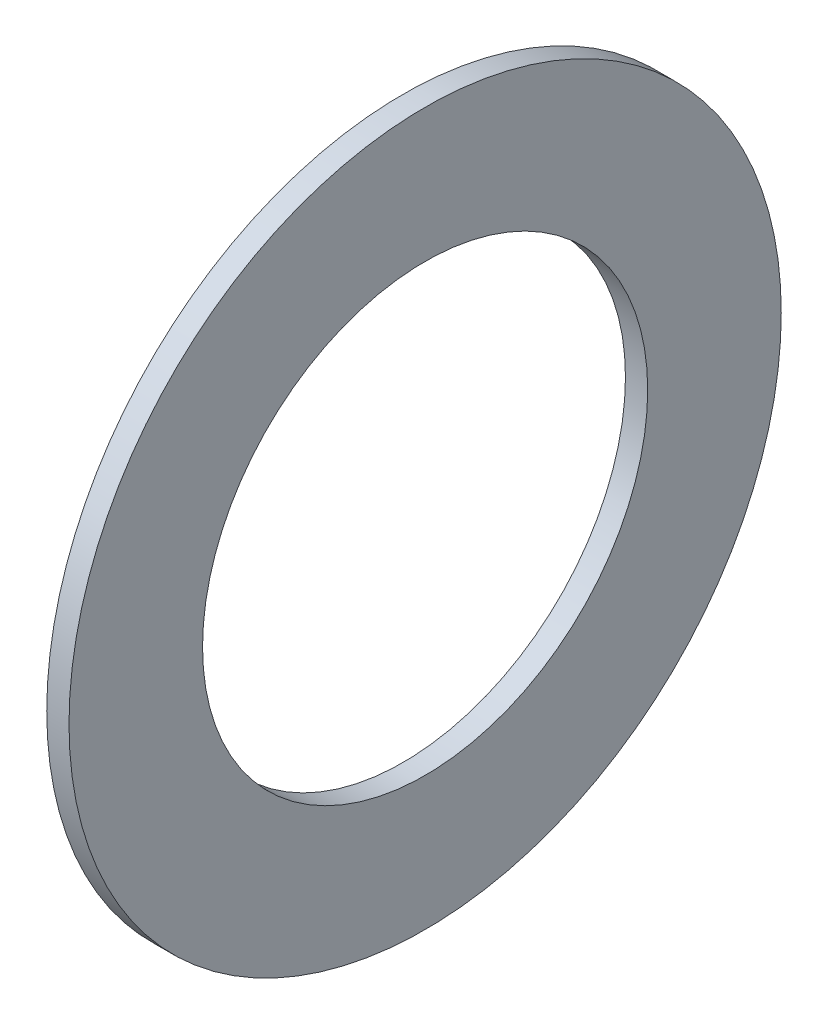
ISO-10303-21;
HEADER;
FILE_DESCRIPTION(('STEP AP214'),'2;1');
FILE_NAME('part.step','',(''),(''),'','','');
FILE_SCHEMA(('AUTOMOTIVE_DESIGN { 1 0 10303 214 1 1 1 1 }'));
ENDSEC;
DATA;
#1=APPLICATION_CONTEXT('core data for automotive mechanical design processes');
#2=APPLICATION_PROTOCOL_DEFINITION('international standard','automotive_design',2000,#1);
#3=PRODUCT_CONTEXT('',#1,'mechanical');
#4=PRODUCT('Part','Part','',(#3));
#5=PRODUCT_RELATED_PRODUCT_CATEGORY('part','',(#4));
#6=PRODUCT_DEFINITION_FORMATION('','',#4);
#7=PRODUCT_DEFINITION_CONTEXT('part definition',#1,'design');
#8=PRODUCT_DEFINITION('design','',#6,#7);
#9=PRODUCT_DEFINITION_SHAPE('','',#8);
#10=(LENGTH_UNIT() NAMED_UNIT(*) SI_UNIT(.MILLI.,.METRE.));
#11=(NAMED_UNIT(*) PLANE_ANGLE_UNIT() SI_UNIT($,.RADIAN.));
#12=(NAMED_UNIT(*) SI_UNIT($,.STERADIAN.) SOLID_ANGLE_UNIT());
#13=UNCERTAINTY_MEASURE_WITH_UNIT(LENGTH_MEASURE(1.E-05),#10,'distance_accuracy_value','');
#14=(GEOMETRIC_REPRESENTATION_CONTEXT(3) GLOBAL_UNCERTAINTY_ASSIGNED_CONTEXT((#13)) GLOBAL_UNIT_ASSIGNED_CONTEXT((#10,
#11,#12)) REPRESENTATION_CONTEXT('',''));
#15=CARTESIAN_POINT('',(0.,0.,0.));
#16=DIRECTION('',(0.,0.,1.));
#17=DIRECTION('',(1.,0.,0.));
#18=AXIS2_PLACEMENT_3D('',#15,#16,#17);
#19=CARTESIAN_POINT('',(0.5,0.,0.));
#20=DIRECTION('',(1.,0.,0.));
#21=DIRECTION('',(0.,0.,-1.));
#22=AXIS2_PLACEMENT_3D('',#19,#20,#21);
#23=PLANE('',#22);
#24=CARTESIAN_POINT('',(0.5,0.,0.));
#25=DIRECTION('',(1.,0.,0.));
#26=DIRECTION('',(0.,0.,-1.));
#27=AXIS2_PLACEMENT_3D('',#24,#25,#26);
#28=CIRCLE('',#27,8.);
#29=CARTESIAN_POINT('',(0.5,0.,-8.));
#30=VERTEX_POINT('',#29);
#31=EDGE_CURVE('E10',#30,#30,#28,.T.);
#32=ORIENTED_EDGE('',*,*,#31,.T.);
#33=EDGE_LOOP('',(#32));
#34=FACE_BOUND('',#33,.T.);
#35=CARTESIAN_POINT('',(0.5,0.,0.));
#36=DIRECTION('',(1.,0.,0.));
#37=DIRECTION('',(0.,0.,-1.));
#38=AXIS2_PLACEMENT_3D('',#35,#36,#37);
#39=CIRCLE('',#38,5.);
#40=CARTESIAN_POINT('',(0.5,0.,-5.));
#41=VERTEX_POINT('',#40);
#42=EDGE_CURVE('E41',#41,#41,#39,.T.);
#43=ORIENTED_EDGE('',*,*,#42,.F.);
#44=EDGE_LOOP('',(#43));
#45=FACE_BOUND('',#44,.T.);
#46=ADVANCED_FACE('F30',(#34,#45),#23,.T.);
#47=CARTESIAN_POINT('',(0.,0.,0.));
#48=DIRECTION('',(1.,0.,0.));
#49=DIRECTION('',(0.,0.,-1.));
#50=AXIS2_PLACEMENT_3D('',#47,#48,#49);
#51=PLANE('',#50);
#52=CARTESIAN_POINT('',(0.,0.,0.));
#53=DIRECTION('',(1.,0.,0.));
#54=DIRECTION('',(0.,0.,-1.));
#55=AXIS2_PLACEMENT_3D('',#52,#53,#54);
#56=CIRCLE('',#55,8.);
#57=CARTESIAN_POINT('',(0.,0.,-8.));
#58=VERTEX_POINT('',#57);
#59=EDGE_CURVE('E34',#58,#58,#56,.T.);
#60=ORIENTED_EDGE('',*,*,#59,.F.);
#61=EDGE_LOOP('',(#60));
#62=FACE_BOUND('',#61,.T.);
#63=CARTESIAN_POINT('',(0.,0.,0.));
#64=DIRECTION('',(1.,0.,0.));
#65=DIRECTION('',(0.,0.,-1.));
#66=AXIS2_PLACEMENT_3D('',#63,#64,#65);
#67=CIRCLE('',#66,5.);
#68=CARTESIAN_POINT('',(0.,0.,-5.));
#69=VERTEX_POINT('',#68);
#70=EDGE_CURVE('E43',#69,#69,#67,.T.);
#71=ORIENTED_EDGE('',*,*,#70,.T.);
#72=EDGE_LOOP('',(#71));
#73=FACE_BOUND('',#72,.T.);
#74=ADVANCED_FACE('F53',(#62,#73),#51,.F.);
#75=CARTESIAN_POINT('',(0.5,0.,0.));
#76=DIRECTION('',(-1.,0.,0.));
#77=DIRECTION('',(0.,0.,1.));
#78=AXIS2_PLACEMENT_3D('',#75,#76,#77);
#79=CYLINDRICAL_SURFACE('',#78,8.);
#80=ORIENTED_EDGE('',*,*,#31,.F.);
#81=EDGE_LOOP('',(#80));
#82=FACE_BOUND('',#81,.T.);
#83=ORIENTED_EDGE('',*,*,#59,.T.);
#84=EDGE_LOOP('',(#83));
#85=FACE_BOUND('',#84,.T.);
#86=ADVANCED_FACE('F32',(#82,#85),#79,.T.);
#87=CARTESIAN_POINT('',(0.5,0.,0.));
#88=DIRECTION('',(-1.,0.,0.));
#89=DIRECTION('',(0.,0.,1.));
#90=AXIS2_PLACEMENT_3D('',#87,#88,#89);
#91=CYLINDRICAL_SURFACE('',#90,5.);
#92=ORIENTED_EDGE('',*,*,#42,.T.);
#93=EDGE_LOOP('',(#92));
#94=FACE_BOUND('',#93,.T.);
#95=ORIENTED_EDGE('',*,*,#70,.F.);
#96=EDGE_LOOP('',(#95));
#97=FACE_BOUND('',#96,.T.);
#98=ADVANCED_FACE('F49',(#94,#97),#91,.F.);
#99=CLOSED_SHELL('',(#46,#74,#86,#98));
#100=MANIFOLD_SOLID_BREP('B2',#99);
#101=ADVANCED_BREP_SHAPE_REPRESENTATION('',(#18,#100),#14);
#102=SHAPE_DEFINITION_REPRESENTATION(#9,#101);
ENDSEC;
END-ISO-10303-21;
